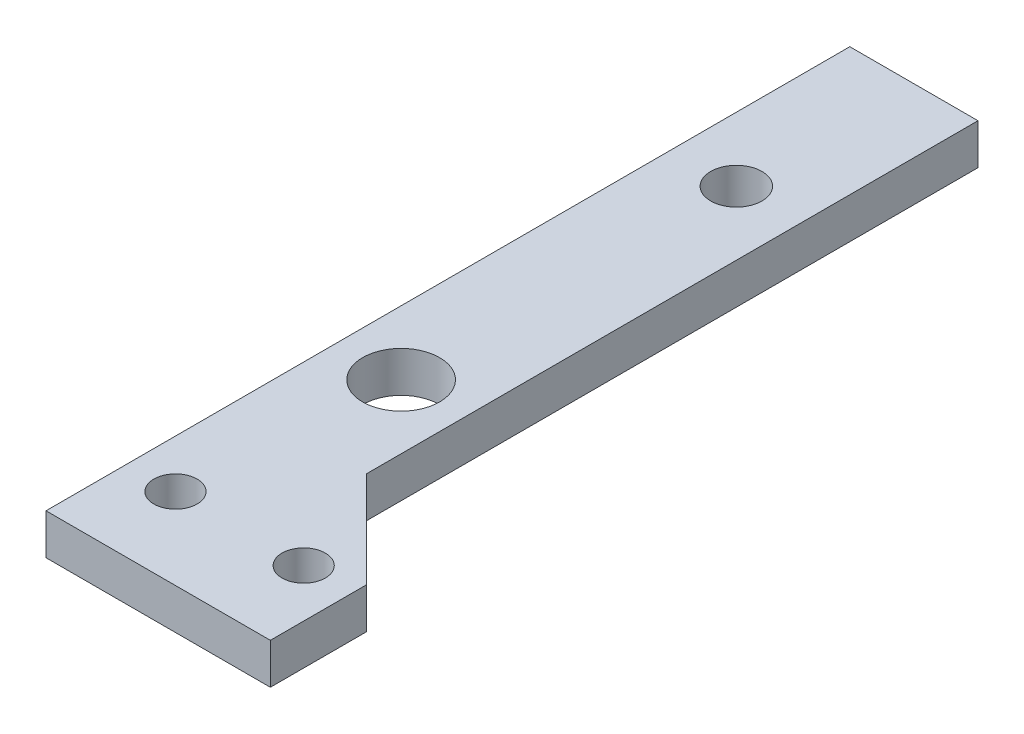
ISO-10303-21;
HEADER;
FILE_DESCRIPTION(('STEP AP214'),'2;1');
FILE_NAME('part.step','',(''),(''),'','','');
FILE_SCHEMA(('AUTOMOTIVE_DESIGN { 1 0 10303 214 1 1 1 1 }'));
ENDSEC;
DATA;
#1=APPLICATION_CONTEXT('core data for automotive mechanical design processes');
#2=APPLICATION_PROTOCOL_DEFINITION('international standard','automotive_design',2000,#1);
#3=PRODUCT_CONTEXT('',#1,'mechanical');
#4=PRODUCT('Part','Part','',(#3));
#5=PRODUCT_RELATED_PRODUCT_CATEGORY('part','',(#4));
#6=PRODUCT_DEFINITION_FORMATION('','',#4);
#7=PRODUCT_DEFINITION_CONTEXT('part definition',#1,'design');
#8=PRODUCT_DEFINITION('design','',#6,#7);
#9=PRODUCT_DEFINITION_SHAPE('','',#8);
#10=(LENGTH_UNIT() NAMED_UNIT(*) SI_UNIT(.MILLI.,.METRE.));
#11=(NAMED_UNIT(*) PLANE_ANGLE_UNIT() SI_UNIT($,.RADIAN.));
#12=(NAMED_UNIT(*) SI_UNIT($,.STERADIAN.) SOLID_ANGLE_UNIT());
#13=UNCERTAINTY_MEASURE_WITH_UNIT(LENGTH_MEASURE(1.E-05),#10,'distance_accuracy_value','');
#14=(GEOMETRIC_REPRESENTATION_CONTEXT(3) GLOBAL_UNCERTAINTY_ASSIGNED_CONTEXT((#13)) GLOBAL_UNIT_ASSIGNED_CONTEXT((#10,
#11,#12)) REPRESENTATION_CONTEXT('',''));
#15=CARTESIAN_POINT('',(0.,0.,0.));
#16=DIRECTION('',(0.,0.,1.));
#17=DIRECTION('',(1.,0.,0.));
#18=AXIS2_PLACEMENT_3D('',#15,#16,#17);
#19=CARTESIAN_POINT('',(20.,6.35,0.));
#20=DIRECTION('',(-1.,0.,0.));
#21=DIRECTION('',(0.,0.,1.));
#22=AXIS2_PLACEMENT_3D('',#19,#20,#21);
#23=PLANE('',#22);
#24=DIRECTION('',(0.,1.,0.));
#25=VECTOR('',#24,1.);
#26=CARTESIAN_POINT('',(20.,-33.541019662497,95.3999999999999));
#27=LINE('',#26,#25);
#28=CARTESIAN_POINT('',(20.,0.,95.3999999999999));
#29=VERTEX_POINT('',#28);
#30=CARTESIAN_POINT('',(20.,6.35,95.3999999999999));
#31=VERTEX_POINT('',#30);
#32=EDGE_CURVE('E60',#29,#31,#27,.T.);
#33=ORIENTED_EDGE('',*,*,#32,.F.);
#34=DIRECTION('',(0.,0.,-1.));
#35=VECTOR('',#34,1.);
#36=CARTESIAN_POINT('',(20.,0.,0.));
#37=LINE('',#36,#35);
#38=CARTESIAN_POINT('',(20.,0.,0.));
#39=VERTEX_POINT('',#38);
#40=EDGE_CURVE('E89',#29,#39,#37,.T.);
#41=ORIENTED_EDGE('',*,*,#40,.T.);
#42=DIRECTION('',(0.,-1.,0.));
#43=VECTOR('',#42,1.);
#44=CARTESIAN_POINT('',(20.,6.35,0.));
#45=LINE('',#44,#43);
#46=CARTESIAN_POINT('',(20.,6.35,0.));
#47=VERTEX_POINT('',#46);
#48=EDGE_CURVE('E11',#47,#39,#45,.T.);
#49=ORIENTED_EDGE('',*,*,#48,.F.);
#50=DIRECTION('',(0.,0.,-1.));
#51=VECTOR('',#50,1.);
#52=CARTESIAN_POINT('',(20.,6.35,0.));
#53=LINE('',#52,#51);
#54=EDGE_CURVE('E115',#31,#47,#53,.T.);
#55=ORIENTED_EDGE('',*,*,#54,.F.);
#56=EDGE_LOOP('',(#33,#41,#49,#55));
#57=FACE_BOUND('',#56,.T.);
#58=ADVANCED_FACE('F44',(#57),#23,.F.);
#59=CARTESIAN_POINT('',(0.,6.35,0.));
#60=DIRECTION('',(0.,1.,0.));
#61=DIRECTION('',(0.,0.,1.));
#62=AXIS2_PLACEMENT_3D('',#59,#60,#61);
#63=PLANE('',#62);
#64=CARTESIAN_POINT('',(7.5,6.35,112.7));
#65=DIRECTION('',(0.,1.,0.));
#66=DIRECTION('',(0.,0.,1.));
#67=AXIS2_PLACEMENT_3D('',#64,#65,#66);
#68=CIRCLE('',#67,3.37819999999999);
#69=CARTESIAN_POINT('',(7.5,6.35,116.0782));
#70=VERTEX_POINT('',#69);
#71=EDGE_CURVE('E177',#70,#70,#68,.T.);
#72=ORIENTED_EDGE('',*,*,#71,.F.);
#73=EDGE_LOOP('',(#72));
#74=FACE_BOUND('',#73,.T.);
#75=CARTESIAN_POINT('',(27.5,6.35,112.7));
#76=DIRECTION('',(0.,1.,0.));
#77=DIRECTION('',(0.,0.,1.));
#78=AXIS2_PLACEMENT_3D('',#75,#76,#77);
#79=CIRCLE('',#78,3.37819999999999);
#80=CARTESIAN_POINT('',(27.5,6.35,116.0782));
#81=VERTEX_POINT('',#80);
#82=EDGE_CURVE('E169',#81,#81,#79,.T.);
#83=ORIENTED_EDGE('',*,*,#82,.F.);
#84=EDGE_LOOP('',(#83));
#85=FACE_BOUND('',#84,.T.);
#86=CARTESIAN_POINT('',(10.,6.35,80.));
#87=DIRECTION('',(0.,1.,0.));
#88=DIRECTION('',(0.,0.,1.));
#89=AXIS2_PLACEMENT_3D('',#86,#87,#88);
#90=CIRCLE('',#89,6.00000000000001);
#91=CARTESIAN_POINT('',(10.,6.35,86.));
#92=VERTEX_POINT('',#91);
#93=EDGE_CURVE('E104',#92,#92,#90,.T.);
#94=ORIENTED_EDGE('',*,*,#93,.F.);
#95=EDGE_LOOP('',(#94));
#96=FACE_BOUND('',#95,.T.);
#97=DIRECTION('',(0.,0.,1.));
#98=VECTOR('',#97,1.);
#99=CARTESIAN_POINT('',(0.,6.35,0.));
#100=LINE('',#99,#98);
#101=CARTESIAN_POINT('',(0.,6.35,0.));
#102=VERTEX_POINT('',#101);
#103=CARTESIAN_POINT('',(0.,6.35,125.4));
#104=VERTEX_POINT('',#103);
#105=EDGE_CURVE('E88',#102,#104,#100,.T.);
#106=ORIENTED_EDGE('',*,*,#105,.T.);
#107=DIRECTION('',(1.,0.,0.));
#108=VECTOR('',#107,1.);
#109=CARTESIAN_POINT('',(0.,6.35,125.4));
#110=LINE('',#109,#108);
#111=CARTESIAN_POINT('',(35.,6.35,125.4));
#112=VERTEX_POINT('',#111);
#113=EDGE_CURVE('E136',#104,#112,#110,.T.);
#114=ORIENTED_EDGE('',*,*,#113,.T.);
#115=DIRECTION('',(0.,0.,-1.));
#116=VECTOR('',#115,1.);
#117=CARTESIAN_POINT('',(35.,6.35,125.4));
#118=LINE('',#117,#116);
#119=CARTESIAN_POINT('',(35.,6.35,110.4));
#120=VERTEX_POINT('',#119);
#121=EDGE_CURVE('E156',#112,#120,#118,.T.);
#122=ORIENTED_EDGE('',*,*,#121,.T.);
#123=DIRECTION('',(-0.707106781186544,0.,-0.707106781186551));
#124=VECTOR('',#123,1.);
#125=CARTESIAN_POINT('',(35.,6.35,110.4));
#126=LINE('',#125,#124);
#127=EDGE_CURVE('E146',#120,#31,#126,.T.);
#128=ORIENTED_EDGE('',*,*,#127,.T.);
#129=ORIENTED_EDGE('',*,*,#54,.T.);
#130=DIRECTION('',(-1.,0.,0.));
#131=VECTOR('',#130,1.);
#132=CARTESIAN_POINT('',(0.,6.35,0.));
#133=LINE('',#132,#131);
#134=EDGE_CURVE('E69',#47,#102,#133,.T.);
#135=ORIENTED_EDGE('',*,*,#134,.T.);
#136=EDGE_LOOP('',(#106,#114,#122,#128,#129,#135));
#137=FACE_BOUND('',#136,.T.);
#138=CARTESIAN_POINT('',(10.,6.35,27.7));
#139=DIRECTION('',(0.,1.,0.));
#140=DIRECTION('',(0.,0.,1.));
#141=AXIS2_PLACEMENT_3D('',#138,#139,#140);
#142=CIRCLE('',#141,4.);
#143=CARTESIAN_POINT('',(10.,6.35,31.7));
#144=VERTEX_POINT('',#143);
#145=EDGE_CURVE('E122',#144,#144,#142,.T.);
#146=ORIENTED_EDGE('',*,*,#145,.F.);
#147=EDGE_LOOP('',(#146));
#148=FACE_BOUND('',#147,.T.);
#149=ADVANCED_FACE('F184',(#74,#85,#96,#137,#148),#63,.T.);
#150=CARTESIAN_POINT('',(0.,0.,0.));
#151=DIRECTION('',(0.,1.,0.));
#152=DIRECTION('',(0.,0.,1.));
#153=AXIS2_PLACEMENT_3D('',#150,#151,#152);
#154=PLANE('',#153);
#155=CARTESIAN_POINT('',(7.5,0.,112.7));
#156=DIRECTION('',(0.,1.,0.));
#157=DIRECTION('',(0.,0.,1.));
#158=AXIS2_PLACEMENT_3D('',#155,#156,#157);
#159=CIRCLE('',#158,3.3782);
#160=CARTESIAN_POINT('',(7.5,0.,116.0782));
#161=VERTEX_POINT('',#160);
#162=EDGE_CURVE('E173',#161,#161,#159,.T.);
#163=ORIENTED_EDGE('',*,*,#162,.T.);
#164=EDGE_LOOP('',(#163));
#165=FACE_BOUND('',#164,.T.);
#166=CARTESIAN_POINT('',(27.5,0.,112.7));
#167=DIRECTION('',(0.,1.,0.));
#168=DIRECTION('',(0.,0.,1.));
#169=AXIS2_PLACEMENT_3D('',#166,#167,#168);
#170=CIRCLE('',#169,3.3782);
#171=CARTESIAN_POINT('',(27.5,0.,116.0782));
#172=VERTEX_POINT('',#171);
#173=EDGE_CURVE('E160',#172,#172,#170,.T.);
#174=ORIENTED_EDGE('',*,*,#173,.T.);
#175=EDGE_LOOP('',(#174));
#176=FACE_BOUND('',#175,.T.);
#177=DIRECTION('',(0.,0.,1.));
#178=VECTOR('',#177,1.);
#179=CARTESIAN_POINT('',(0.,0.,0.));
#180=LINE('',#179,#178);
#181=CARTESIAN_POINT('',(0.,0.,0.));
#182=VERTEX_POINT('',#181);
#183=CARTESIAN_POINT('',(0.,0.,125.4));
#184=VERTEX_POINT('',#183);
#185=EDGE_CURVE('E94',#182,#184,#180,.T.);
#186=ORIENTED_EDGE('',*,*,#185,.F.);
#187=DIRECTION('',(-1.,0.,0.));
#188=VECTOR('',#187,1.);
#189=CARTESIAN_POINT('',(0.,0.,0.));
#190=LINE('',#189,#188);
#191=EDGE_CURVE('E80',#39,#182,#190,.T.);
#192=ORIENTED_EDGE('',*,*,#191,.F.);
#193=ORIENTED_EDGE('',*,*,#40,.F.);
#194=DIRECTION('',(0.707106781186544,0.,0.707106781186551));
#195=VECTOR('',#194,1.);
#196=CARTESIAN_POINT('',(35.,0.,110.4));
#197=LINE('',#196,#195);
#198=CARTESIAN_POINT('',(35.,0.,110.4));
#199=VERTEX_POINT('',#198);
#200=EDGE_CURVE('E140',#29,#199,#197,.T.);
#201=ORIENTED_EDGE('',*,*,#200,.T.);
#202=DIRECTION('',(0.,0.,1.));
#203=VECTOR('',#202,1.);
#204=CARTESIAN_POINT('',(35.,0.,125.4));
#205=LINE('',#204,#203);
#206=CARTESIAN_POINT('',(35.,0.,125.4));
#207=VERTEX_POINT('',#206);
#208=EDGE_CURVE('E152',#199,#207,#205,.T.);
#209=ORIENTED_EDGE('',*,*,#208,.T.);
#210=DIRECTION('',(-1.,0.,0.));
#211=VECTOR('',#210,1.);
#212=CARTESIAN_POINT('',(0.,0.,125.4));
#213=LINE('',#212,#211);
#214=EDGE_CURVE('E101',#207,#184,#213,.T.);
#215=ORIENTED_EDGE('',*,*,#214,.T.);
#216=EDGE_LOOP('',(#186,#192,#193,#201,#209,#215));
#217=FACE_BOUND('',#216,.T.);
#218=CARTESIAN_POINT('',(10.,0.,80.));
#219=DIRECTION('',(0.,1.,0.));
#220=DIRECTION('',(0.,0.,1.));
#221=AXIS2_PLACEMENT_3D('',#218,#219,#220);
#222=CIRCLE('',#221,6.00000000000001);
#223=CARTESIAN_POINT('',(10.,0.,86.));
#224=VERTEX_POINT('',#223);
#225=EDGE_CURVE('E110',#224,#224,#222,.T.);
#226=ORIENTED_EDGE('',*,*,#225,.T.);
#227=EDGE_LOOP('',(#226));
#228=FACE_BOUND('',#227,.T.);
#229=CARTESIAN_POINT('',(10.,0.,27.7));
#230=DIRECTION('',(0.,1.,0.));
#231=DIRECTION('',(0.,0.,1.));
#232=AXIS2_PLACEMENT_3D('',#229,#230,#231);
#233=CIRCLE('',#232,4.);
#234=CARTESIAN_POINT('',(10.,0.,31.7));
#235=VERTEX_POINT('',#234);
#236=EDGE_CURVE('E124',#235,#235,#233,.T.);
#237=ORIENTED_EDGE('',*,*,#236,.T.);
#238=EDGE_LOOP('',(#237));
#239=FACE_BOUND('',#238,.T.);
#240=ADVANCED_FACE('F97',(#165,#176,#217,#228,#239),#154,.F.);
#241=CARTESIAN_POINT('',(0.,6.35,0.));
#242=DIRECTION('',(1.,0.,0.));
#243=DIRECTION('',(0.,0.,-1.));
#244=AXIS2_PLACEMENT_3D('',#241,#242,#243);
#245=PLANE('',#244);
#246=ORIENTED_EDGE('',*,*,#185,.T.);
#247=DIRECTION('',(0.,1.,0.));
#248=VECTOR('',#247,1.);
#249=CARTESIAN_POINT('',(0.,-32.3289344086687,125.4));
#250=LINE('',#249,#248);
#251=EDGE_CURVE('E133',#184,#104,#250,.T.);
#252=ORIENTED_EDGE('',*,*,#251,.T.);
#253=ORIENTED_EDGE('',*,*,#105,.F.);
#254=DIRECTION('',(0.,-1.,0.));
#255=VECTOR('',#254,1.);
#256=CARTESIAN_POINT('',(0.,6.35,0.));
#257=LINE('',#256,#255);
#258=EDGE_CURVE('E53',#102,#182,#257,.T.);
#259=ORIENTED_EDGE('',*,*,#258,.T.);
#260=EDGE_LOOP('',(#246,#252,#253,#259));
#261=FACE_BOUND('',#260,.T.);
#262=ADVANCED_FACE('F46',(#261),#245,.F.);
#263=CARTESIAN_POINT('',(0.,6.35,0.));
#264=DIRECTION('',(0.,0.,1.));
#265=DIRECTION('',(1.,0.,0.));
#266=AXIS2_PLACEMENT_3D('',#263,#264,#265);
#267=PLANE('',#266);
#268=ORIENTED_EDGE('',*,*,#191,.T.);
#269=ORIENTED_EDGE('',*,*,#258,.F.);
#270=ORIENTED_EDGE('',*,*,#134,.F.);
#271=ORIENTED_EDGE('',*,*,#48,.T.);
#272=EDGE_LOOP('',(#268,#269,#270,#271));
#273=FACE_BOUND('',#272,.T.);
#274=ADVANCED_FACE('F82',(#273),#267,.F.);
#275=CARTESIAN_POINT('',(10.,6.35,80.));
#276=DIRECTION('',(0.,-1.,0.));
#277=DIRECTION('',(0.,0.,-1.));
#278=AXIS2_PLACEMENT_3D('',#275,#276,#277);
#279=CYLINDRICAL_SURFACE('',#278,6.00000000000001);
#280=ORIENTED_EDGE('',*,*,#93,.T.);
#281=EDGE_LOOP('',(#280));
#282=FACE_BOUND('',#281,.T.);
#283=ORIENTED_EDGE('',*,*,#225,.F.);
#284=EDGE_LOOP('',(#283));
#285=FACE_BOUND('',#284,.T.);
#286=ADVANCED_FACE('F199',(#282,#285),#279,.F.);
#287=CARTESIAN_POINT('',(10.,6.35,27.7));
#288=DIRECTION('',(0.,-1.,0.));
#289=DIRECTION('',(0.,0.,-1.));
#290=AXIS2_PLACEMENT_3D('',#287,#288,#289);
#291=CYLINDRICAL_SURFACE('',#290,4.);
#292=ORIENTED_EDGE('',*,*,#145,.T.);
#293=EDGE_LOOP('',(#292));
#294=FACE_BOUND('',#293,.T.);
#295=ORIENTED_EDGE('',*,*,#236,.F.);
#296=EDGE_LOOP('',(#295));
#297=FACE_BOUND('',#296,.T.);
#298=ADVANCED_FACE('F195',(#294,#297),#291,.F.);
#299=CARTESIAN_POINT('',(0.,-32.3289344086687,125.4));
#300=DIRECTION('',(0.,0.,1.));
#301=DIRECTION('',(1.,0.,0.));
#302=AXIS2_PLACEMENT_3D('',#299,#300,#301);
#303=PLANE('',#302);
#304=ORIENTED_EDGE('',*,*,#214,.F.);
#305=DIRECTION('',(0.,1.,0.));
#306=VECTOR('',#305,1.);
#307=CARTESIAN_POINT('',(35.,-33.541019662497,125.4));
#308=LINE('',#307,#306);
#309=EDGE_CURVE('E141',#207,#112,#308,.T.);
#310=ORIENTED_EDGE('',*,*,#309,.T.);
#311=ORIENTED_EDGE('',*,*,#113,.F.);
#312=ORIENTED_EDGE('',*,*,#251,.F.);
#313=EDGE_LOOP('',(#304,#310,#311,#312));
#314=FACE_BOUND('',#313,.T.);
#315=ADVANCED_FACE('F198',(#314),#303,.T.);
#316=CARTESIAN_POINT('',(35.,-33.541019662497,110.4));
#317=DIRECTION('',(0.707106781186551,0.,-0.707106781186544));
#318=DIRECTION('',(-0.707106781186544,0.,-0.707106781186551));
#319=AXIS2_PLACEMENT_3D('',#316,#317,#318);
#320=PLANE('',#319);
#321=ORIENTED_EDGE('',*,*,#200,.F.);
#322=ORIENTED_EDGE('',*,*,#32,.T.);
#323=ORIENTED_EDGE('',*,*,#127,.F.);
#324=DIRECTION('',(0.,1.,0.));
#325=VECTOR('',#324,1.);
#326=CARTESIAN_POINT('',(35.,-33.541019662497,110.4));
#327=LINE('',#326,#325);
#328=EDGE_CURVE('E145',#199,#120,#327,.T.);
#329=ORIENTED_EDGE('',*,*,#328,.F.);
#330=EDGE_LOOP('',(#321,#322,#323,#329));
#331=FACE_BOUND('',#330,.T.);
#332=ADVANCED_FACE('F227',(#331),#320,.T.);
#333=CARTESIAN_POINT('',(35.,-33.541019662497,125.4));
#334=DIRECTION('',(1.,0.,0.));
#335=DIRECTION('',(0.,0.,-1.));
#336=AXIS2_PLACEMENT_3D('',#333,#334,#335);
#337=PLANE('',#336);
#338=ORIENTED_EDGE('',*,*,#208,.F.);
#339=ORIENTED_EDGE('',*,*,#328,.T.);
#340=ORIENTED_EDGE('',*,*,#121,.F.);
#341=ORIENTED_EDGE('',*,*,#309,.F.);
#342=EDGE_LOOP('',(#338,#339,#340,#341));
#343=FACE_BOUND('',#342,.T.);
#344=ADVANCED_FACE('F229',(#343),#337,.T.);
#345=CARTESIAN_POINT('',(27.5,6.35,112.7));
#346=DIRECTION('',(0.,1.,0.));
#347=DIRECTION('',(0.,0.,1.));
#348=AXIS2_PLACEMENT_3D('',#345,#346,#347);
#349=CYLINDRICAL_SURFACE('',#348,3.37819999999999);
#350=ORIENTED_EDGE('',*,*,#173,.F.);
#351=EDGE_LOOP('',(#350));
#352=FACE_BOUND('',#351,.T.);
#353=ORIENTED_EDGE('',*,*,#82,.T.);
#354=EDGE_LOOP('',(#353));
#355=FACE_BOUND('',#354,.T.);
#356=ADVANCED_FACE('F232',(#352,#355),#349,.F.);
#357=CARTESIAN_POINT('',(7.5,6.35,112.7));
#358=DIRECTION('',(0.,1.,0.));
#359=DIRECTION('',(0.,0.,1.));
#360=AXIS2_PLACEMENT_3D('',#357,#358,#359);
#361=CYLINDRICAL_SURFACE('',#360,3.37819999999999);
#362=ORIENTED_EDGE('',*,*,#162,.F.);
#363=EDGE_LOOP('',(#362));
#364=FACE_BOUND('',#363,.T.);
#365=ORIENTED_EDGE('',*,*,#71,.T.);
#366=EDGE_LOOP('',(#365));
#367=FACE_BOUND('',#366,.T.);
#368=ADVANCED_FACE('F182',(#364,#367),#361,.F.);
#369=CLOSED_SHELL('',(#58,#149,#240,#262,#274,#286,#298,#315,#332,#344,#356,#368));
#370=MANIFOLD_SOLID_BREP('B2',#369);
#371=ADVANCED_BREP_SHAPE_REPRESENTATION('',(#18,#370),#14);
#372=SHAPE_DEFINITION_REPRESENTATION(#9,#371);
ENDSEC;
END-ISO-10303-21;
